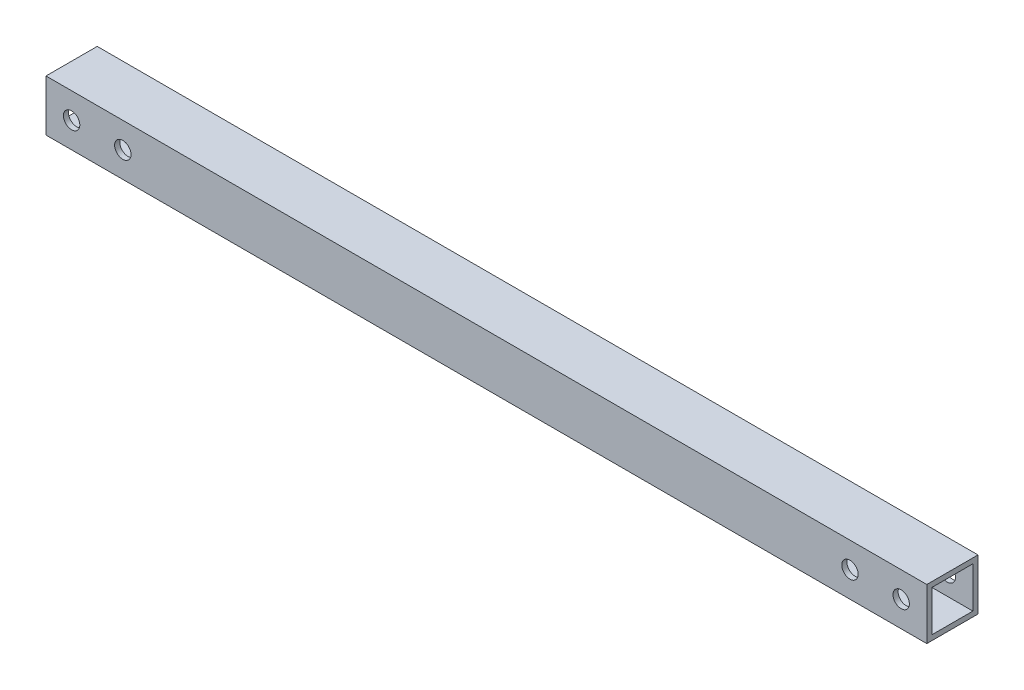
ISO-10303-21;
HEADER;
FILE_DESCRIPTION(('STEP AP214'),'2;1');
FILE_NAME('part.step','',(''),(''),'','','');
FILE_SCHEMA(('AUTOMOTIVE_DESIGN { 1 0 10303 214 1 1 1 1 }'));
ENDSEC;
DATA;
#1=APPLICATION_CONTEXT('core data for automotive mechanical design processes');
#2=APPLICATION_PROTOCOL_DEFINITION('international standard','automotive_design',2000,#1);
#3=PRODUCT_CONTEXT('',#1,'mechanical');
#4=PRODUCT('Part','Part','',(#3));
#5=PRODUCT_RELATED_PRODUCT_CATEGORY('part','',(#4));
#6=PRODUCT_DEFINITION_FORMATION('','',#4);
#7=PRODUCT_DEFINITION_CONTEXT('part definition',#1,'design');
#8=PRODUCT_DEFINITION('design','',#6,#7);
#9=PRODUCT_DEFINITION_SHAPE('','',#8);
#10=(LENGTH_UNIT() NAMED_UNIT(*) SI_UNIT(.MILLI.,.METRE.));
#11=(NAMED_UNIT(*) PLANE_ANGLE_UNIT() SI_UNIT($,.RADIAN.));
#12=(NAMED_UNIT(*) SI_UNIT($,.STERADIAN.) SOLID_ANGLE_UNIT());
#13=UNCERTAINTY_MEASURE_WITH_UNIT(LENGTH_MEASURE(1.E-05),#10,'distance_accuracy_value','');
#14=(GEOMETRIC_REPRESENTATION_CONTEXT(3) GLOBAL_UNCERTAINTY_ASSIGNED_CONTEXT((#13)) GLOBAL_UNIT_ASSIGNED_CONTEXT((#10,
#11,#12)) REPRESENTATION_CONTEXT('',''));
#15=CARTESIAN_POINT('',(0.,0.,0.));
#16=DIRECTION('',(0.,0.,1.));
#17=DIRECTION('',(1.,0.,0.));
#18=AXIS2_PLACEMENT_3D('',#15,#16,#17);
#19=CARTESIAN_POINT('',(172.,0.,0.));
#20=DIRECTION('',(1.,0.,0.));
#21=DIRECTION('',(0.,0.,-1.));
#22=AXIS2_PLACEMENT_3D('',#19,#20,#21);
#23=PLANE('',#22);
#24=DIRECTION('',(0.,1.,0.));
#25=VECTOR('',#24,1.);
#26=CARTESIAN_POINT('',(172.,5.,-5.));
#27=LINE('',#26,#25);
#28=CARTESIAN_POINT('',(172.,-5.,-5.));
#29=VERTEX_POINT('',#28);
#30=CARTESIAN_POINT('',(172.,5.,-5.));
#31=VERTEX_POINT('',#30);
#32=EDGE_CURVE('E164',#29,#31,#27,.T.);
#33=ORIENTED_EDGE('',*,*,#32,.T.);
#34=DIRECTION('',(0.,0.,1.));
#35=VECTOR('',#34,1.);
#36=CARTESIAN_POINT('',(172.,5.,5.));
#37=LINE('',#36,#35);
#38=CARTESIAN_POINT('',(172.,5.,5.));
#39=VERTEX_POINT('',#38);
#40=EDGE_CURVE('E167',#31,#39,#37,.T.);
#41=ORIENTED_EDGE('',*,*,#40,.T.);
#42=DIRECTION('',(0.,-1.,0.));
#43=VECTOR('',#42,1.);
#44=CARTESIAN_POINT('',(172.,5.,5.));
#45=LINE('',#44,#43);
#46=CARTESIAN_POINT('',(172.,-5.,5.));
#47=VERTEX_POINT('',#46);
#48=EDGE_CURVE('E170',#39,#47,#45,.T.);
#49=ORIENTED_EDGE('',*,*,#48,.T.);
#50=DIRECTION('',(0.,0.,-1.));
#51=VECTOR('',#50,1.);
#52=CARTESIAN_POINT('',(172.,-5.,5.));
#53=LINE('',#52,#51);
#54=EDGE_CURVE('E172',#47,#29,#53,.T.);
#55=ORIENTED_EDGE('',*,*,#54,.T.);
#56=EDGE_LOOP('',(#33,#41,#49,#55));
#57=FACE_BOUND('',#56,.T.);
#58=DIRECTION('',(0.,0.,1.));
#59=VECTOR('',#58,1.);
#60=CARTESIAN_POINT('',(172.,4.,5.));
#61=LINE('',#60,#59);
#62=CARTESIAN_POINT('',(172.,4.,-4.));
#63=VERTEX_POINT('',#62);
#64=CARTESIAN_POINT('',(172.,4.,4.));
#65=VERTEX_POINT('',#64);
#66=EDGE_CURVE('E134',#63,#65,#61,.T.);
#67=ORIENTED_EDGE('',*,*,#66,.F.);
#68=DIRECTION('',(0.,1.,0.));
#69=VECTOR('',#68,1.);
#70=CARTESIAN_POINT('',(172.,5.,-4.));
#71=LINE('',#70,#69);
#72=CARTESIAN_POINT('',(172.,-4.,-4.));
#73=VERTEX_POINT('',#72);
#74=EDGE_CURVE('E126',#73,#63,#71,.T.);
#75=ORIENTED_EDGE('',*,*,#74,.F.);
#76=DIRECTION('',(0.,0.,-1.));
#77=VECTOR('',#76,1.);
#78=CARTESIAN_POINT('',(172.,-4.,5.));
#79=LINE('',#78,#77);
#80=CARTESIAN_POINT('',(172.,-4.,4.));
#81=VERTEX_POINT('',#80);
#82=EDGE_CURVE('E148',#81,#73,#79,.T.);
#83=ORIENTED_EDGE('',*,*,#82,.F.);
#84=DIRECTION('',(0.,-1.,0.));
#85=VECTOR('',#84,1.);
#86=CARTESIAN_POINT('',(172.,5.,4.));
#87=LINE('',#86,#85);
#88=EDGE_CURVE('E146',#65,#81,#87,.T.);
#89=ORIENTED_EDGE('',*,*,#88,.F.);
#90=EDGE_LOOP('',(#67,#75,#83,#89));
#91=FACE_BOUND('',#90,.T.);
#92=ADVANCED_FACE('F59',(#57,#91),#23,.T.);
#93=CARTESIAN_POINT('',(0.,0.,0.));
#94=DIRECTION('',(1.,0.,0.));
#95=DIRECTION('',(0.,0.,-1.));
#96=AXIS2_PLACEMENT_3D('',#93,#94,#95);
#97=PLANE('',#96);
#98=DIRECTION('',(0.,1.,0.));
#99=VECTOR('',#98,1.);
#100=CARTESIAN_POINT('',(0.,5.,-5.));
#101=LINE('',#100,#99);
#102=CARTESIAN_POINT('',(0.,-5.,-5.));
#103=VERTEX_POINT('',#102);
#104=CARTESIAN_POINT('',(0.,5.,-5.));
#105=VERTEX_POINT('',#104);
#106=EDGE_CURVE('E142',#103,#105,#101,.T.);
#107=ORIENTED_EDGE('',*,*,#106,.F.);
#108=DIRECTION('',(0.,0.,-1.));
#109=VECTOR('',#108,1.);
#110=CARTESIAN_POINT('',(0.,-5.,5.));
#111=LINE('',#110,#109);
#112=CARTESIAN_POINT('',(0.,-5.,5.));
#113=VERTEX_POINT('',#112);
#114=EDGE_CURVE('E168',#113,#103,#111,.T.);
#115=ORIENTED_EDGE('',*,*,#114,.F.);
#116=DIRECTION('',(0.,-1.,0.));
#117=VECTOR('',#116,1.);
#118=CARTESIAN_POINT('',(0.,5.,5.));
#119=LINE('',#118,#117);
#120=CARTESIAN_POINT('',(0.,5.,5.));
#121=VERTEX_POINT('',#120);
#122=EDGE_CURVE('E179',#121,#113,#119,.T.);
#123=ORIENTED_EDGE('',*,*,#122,.F.);
#124=DIRECTION('',(0.,0.,1.));
#125=VECTOR('',#124,1.);
#126=CARTESIAN_POINT('',(0.,5.,5.));
#127=LINE('',#126,#125);
#128=EDGE_CURVE('E177',#105,#121,#127,.T.);
#129=ORIENTED_EDGE('',*,*,#128,.F.);
#130=EDGE_LOOP('',(#107,#115,#123,#129));
#131=FACE_BOUND('',#130,.T.);
#132=DIRECTION('',(0.,1.,0.));
#133=VECTOR('',#132,1.);
#134=CARTESIAN_POINT('',(0.,5.,-4.));
#135=LINE('',#134,#133);
#136=CARTESIAN_POINT('',(0.,-4.,-4.));
#137=VERTEX_POINT('',#136);
#138=CARTESIAN_POINT('',(0.,4.,-4.));
#139=VERTEX_POINT('',#138);
#140=EDGE_CURVE('E84',#137,#139,#135,.T.);
#141=ORIENTED_EDGE('',*,*,#140,.T.);
#142=DIRECTION('',(0.,0.,1.));
#143=VECTOR('',#142,1.);
#144=CARTESIAN_POINT('',(0.,4.,5.));
#145=LINE('',#144,#143);
#146=CARTESIAN_POINT('',(0.,4.,4.));
#147=VERTEX_POINT('',#146);
#148=EDGE_CURVE('E141',#139,#147,#145,.T.);
#149=ORIENTED_EDGE('',*,*,#148,.T.);
#150=DIRECTION('',(0.,-1.,0.));
#151=VECTOR('',#150,1.);
#152=CARTESIAN_POINT('',(0.,5.,4.));
#153=LINE('',#152,#151);
#154=CARTESIAN_POINT('',(0.,-4.,4.));
#155=VERTEX_POINT('',#154);
#156=EDGE_CURVE('E156',#147,#155,#153,.T.);
#157=ORIENTED_EDGE('',*,*,#156,.T.);
#158=DIRECTION('',(0.,0.,-1.));
#159=VECTOR('',#158,1.);
#160=CARTESIAN_POINT('',(0.,-4.,5.));
#161=LINE('',#160,#159);
#162=EDGE_CURVE('E135',#155,#137,#161,.T.);
#163=ORIENTED_EDGE('',*,*,#162,.T.);
#164=EDGE_LOOP('',(#141,#149,#157,#163));
#165=FACE_BOUND('',#164,.T.);
#166=ADVANCED_FACE('F231',(#131,#165),#97,.F.);
#167=CARTESIAN_POINT('',(172.,5.,-5.));
#168=DIRECTION('',(0.,0.,1.));
#169=DIRECTION('',(0.,-1.,0.));
#170=AXIS2_PLACEMENT_3D('',#167,#168,#169);
#171=PLANE('',#170);
#172=CARTESIAN_POINT('',(5.,0.,-5.));
#173=DIRECTION('',(0.,0.,1.));
#174=DIRECTION('',(1.,0.,0.));
#175=AXIS2_PLACEMENT_3D('',#172,#173,#174);
#176=CIRCLE('',#175,1.6);
#177=CARTESIAN_POINT('',(6.6,0.,-5.));
#178=VERTEX_POINT('',#177);
#179=EDGE_CURVE('E284',#178,#178,#176,.T.);
#180=ORIENTED_EDGE('',*,*,#179,.T.);
#181=EDGE_LOOP('',(#180));
#182=FACE_BOUND('',#181,.T.);
#183=CARTESIAN_POINT('',(167.,0.,-5.));
#184=DIRECTION('',(0.,0.,1.));
#185=DIRECTION('',(-1.,0.,0.));
#186=AXIS2_PLACEMENT_3D('',#183,#184,#185);
#187=CIRCLE('',#186,1.59999999999999);
#188=CARTESIAN_POINT('',(165.4,0.,-5.));
#189=VERTEX_POINT('',#188);
#190=EDGE_CURVE('E288',#189,#189,#187,.T.);
#191=ORIENTED_EDGE('',*,*,#190,.T.);
#192=EDGE_LOOP('',(#191));
#193=FACE_BOUND('',#192,.T.);
#194=CARTESIAN_POINT('',(157.,0.,-5.));
#195=DIRECTION('',(0.,0.,1.));
#196=DIRECTION('',(-1.,0.,0.));
#197=AXIS2_PLACEMENT_3D('',#194,#195,#196);
#198=CIRCLE('',#197,1.59999999999999);
#199=CARTESIAN_POINT('',(155.4,0.,-5.));
#200=VERTEX_POINT('',#199);
#201=EDGE_CURVE('E292',#200,#200,#198,.T.);
#202=ORIENTED_EDGE('',*,*,#201,.T.);
#203=EDGE_LOOP('',(#202));
#204=FACE_BOUND('',#203,.T.);
#205=CARTESIAN_POINT('',(15.,0.,-5.));
#206=DIRECTION('',(0.,0.,1.));
#207=DIRECTION('',(1.,0.,0.));
#208=AXIS2_PLACEMENT_3D('',#205,#206,#207);
#209=CIRCLE('',#208,1.6);
#210=CARTESIAN_POINT('',(16.6,0.,-5.));
#211=VERTEX_POINT('',#210);
#212=EDGE_CURVE('E193',#211,#211,#209,.T.);
#213=ORIENTED_EDGE('',*,*,#212,.T.);
#214=EDGE_LOOP('',(#213));
#215=FACE_BOUND('',#214,.T.);
#216=ORIENTED_EDGE('',*,*,#106,.T.);
#217=DIRECTION('',(-1.,0.,0.));
#218=VECTOR('',#217,1.);
#219=CARTESIAN_POINT('',(172.,5.,-5.));
#220=LINE('',#219,#218);
#221=EDGE_CURVE('E12',#31,#105,#220,.T.);
#222=ORIENTED_EDGE('',*,*,#221,.F.);
#223=ORIENTED_EDGE('',*,*,#32,.F.);
#224=DIRECTION('',(-1.,0.,0.));
#225=VECTOR('',#224,1.);
#226=CARTESIAN_POINT('',(172.,-5.,-5.));
#227=LINE('',#226,#225);
#228=EDGE_CURVE('E174',#29,#103,#227,.T.);
#229=ORIENTED_EDGE('',*,*,#228,.T.);
#230=EDGE_LOOP('',(#216,#222,#223,#229));
#231=FACE_BOUND('',#230,.T.);
#232=ADVANCED_FACE('F61',(#182,#193,#204,#215,#231),#171,.F.);
#233=CARTESIAN_POINT('',(172.,5.,5.));
#234=DIRECTION('',(0.,-1.,0.));
#235=DIRECTION('',(0.,0.,-1.));
#236=AXIS2_PLACEMENT_3D('',#233,#234,#235);
#237=PLANE('',#236);
#238=ORIENTED_EDGE('',*,*,#128,.T.);
#239=DIRECTION('',(-1.,0.,0.));
#240=VECTOR('',#239,1.);
#241=CARTESIAN_POINT('',(172.,5.,5.));
#242=LINE('',#241,#240);
#243=EDGE_CURVE('E68',#39,#121,#242,.T.);
#244=ORIENTED_EDGE('',*,*,#243,.F.);
#245=ORIENTED_EDGE('',*,*,#40,.F.);
#246=ORIENTED_EDGE('',*,*,#221,.T.);
#247=EDGE_LOOP('',(#238,#244,#245,#246));
#248=FACE_BOUND('',#247,.T.);
#249=ADVANCED_FACE('F259',(#248),#237,.F.);
#250=CARTESIAN_POINT('',(172.,5.,5.));
#251=DIRECTION('',(0.,0.,-1.));
#252=DIRECTION('',(0.,1.,0.));
#253=AXIS2_PLACEMENT_3D('',#250,#251,#252);
#254=PLANE('',#253);
#255=CARTESIAN_POINT('',(5.,0.,5.));
#256=DIRECTION('',(0.,0.,1.));
#257=DIRECTION('',(1.,0.,0.));
#258=AXIS2_PLACEMENT_3D('',#255,#256,#257);
#259=CIRCLE('',#258,1.6);
#260=CARTESIAN_POINT('',(6.6,0.,5.));
#261=VERTEX_POINT('',#260);
#262=EDGE_CURVE('E304',#261,#261,#259,.T.);
#263=ORIENTED_EDGE('',*,*,#262,.F.);
#264=EDGE_LOOP('',(#263));
#265=FACE_BOUND('',#264,.T.);
#266=CARTESIAN_POINT('',(167.,0.,5.));
#267=DIRECTION('',(0.,0.,1.));
#268=DIRECTION('',(-1.,0.,0.));
#269=AXIS2_PLACEMENT_3D('',#266,#267,#268);
#270=CIRCLE('',#269,1.59999999999999);
#271=CARTESIAN_POINT('',(165.4,0.,5.));
#272=VERTEX_POINT('',#271);
#273=EDGE_CURVE('E300',#272,#272,#270,.T.);
#274=ORIENTED_EDGE('',*,*,#273,.F.);
#275=EDGE_LOOP('',(#274));
#276=FACE_BOUND('',#275,.T.);
#277=CARTESIAN_POINT('',(157.,0.,5.));
#278=DIRECTION('',(0.,0.,1.));
#279=DIRECTION('',(-1.,0.,0.));
#280=AXIS2_PLACEMENT_3D('',#277,#278,#279);
#281=CIRCLE('',#280,1.59999999999999);
#282=CARTESIAN_POINT('',(155.4,0.,5.));
#283=VERTEX_POINT('',#282);
#284=EDGE_CURVE('E308',#283,#283,#281,.T.);
#285=ORIENTED_EDGE('',*,*,#284,.F.);
#286=EDGE_LOOP('',(#285));
#287=FACE_BOUND('',#286,.T.);
#288=CARTESIAN_POINT('',(15.,0.,5.));
#289=DIRECTION('',(0.,0.,1.));
#290=DIRECTION('',(1.,0.,0.));
#291=AXIS2_PLACEMENT_3D('',#288,#289,#290);
#292=CIRCLE('',#291,1.6);
#293=CARTESIAN_POINT('',(16.6,0.,5.));
#294=VERTEX_POINT('',#293);
#295=EDGE_CURVE('E296',#294,#294,#292,.T.);
#296=ORIENTED_EDGE('',*,*,#295,.F.);
#297=EDGE_LOOP('',(#296));
#298=FACE_BOUND('',#297,.T.);
#299=ORIENTED_EDGE('',*,*,#122,.T.);
#300=DIRECTION('',(-1.,0.,0.));
#301=VECTOR('',#300,1.);
#302=CARTESIAN_POINT('',(172.,-5.,5.));
#303=LINE('',#302,#301);
#304=EDGE_CURVE('E184',#47,#113,#303,.T.);
#305=ORIENTED_EDGE('',*,*,#304,.F.);
#306=ORIENTED_EDGE('',*,*,#48,.F.);
#307=ORIENTED_EDGE('',*,*,#243,.T.);
#308=EDGE_LOOP('',(#299,#305,#306,#307));
#309=FACE_BOUND('',#308,.T.);
#310=ADVANCED_FACE('F256',(#265,#276,#287,#298,#309),#254,.F.);
#311=CARTESIAN_POINT('',(172.,-5.,5.));
#312=DIRECTION('',(0.,1.,0.));
#313=DIRECTION('',(0.,0.,1.));
#314=AXIS2_PLACEMENT_3D('',#311,#312,#313);
#315=PLANE('',#314);
#316=ORIENTED_EDGE('',*,*,#114,.T.);
#317=ORIENTED_EDGE('',*,*,#228,.F.);
#318=ORIENTED_EDGE('',*,*,#54,.F.);
#319=ORIENTED_EDGE('',*,*,#304,.T.);
#320=EDGE_LOOP('',(#316,#317,#318,#319));
#321=FACE_BOUND('',#320,.T.);
#322=ADVANCED_FACE('F253',(#321),#315,.F.);
#323=CARTESIAN_POINT('',(172.,5.,-4.));
#324=DIRECTION('',(0.,0.,1.));
#325=DIRECTION('',(0.,-1.,0.));
#326=AXIS2_PLACEMENT_3D('',#323,#324,#325);
#327=PLANE('',#326);
#328=CARTESIAN_POINT('',(5.,0.,-4.));
#329=DIRECTION('',(0.,0.,1.));
#330=DIRECTION('',(0.,-1.,0.));
#331=AXIS2_PLACEMENT_3D('',#328,#329,#330);
#332=CIRCLE('',#331,1.6);
#333=CARTESIAN_POINT('',(5.,-1.6,-4.));
#334=VERTEX_POINT('',#333);
#335=EDGE_CURVE('E154',#334,#334,#332,.T.);
#336=ORIENTED_EDGE('',*,*,#335,.F.);
#337=EDGE_LOOP('',(#336));
#338=FACE_BOUND('',#337,.T.);
#339=CARTESIAN_POINT('',(167.,0.,-4.));
#340=DIRECTION('',(0.,0.,1.));
#341=DIRECTION('',(0.,-1.,0.));
#342=AXIS2_PLACEMENT_3D('',#339,#340,#341);
#343=CIRCLE('',#342,1.59999999999999);
#344=CARTESIAN_POINT('',(167.,-1.59999999999999,-4.));
#345=VERTEX_POINT('',#344);
#346=EDGE_CURVE('E199',#345,#345,#343,.T.);
#347=ORIENTED_EDGE('',*,*,#346,.F.);
#348=EDGE_LOOP('',(#347));
#349=FACE_BOUND('',#348,.T.);
#350=CARTESIAN_POINT('',(157.,0.,-4.));
#351=DIRECTION('',(0.,0.,1.));
#352=DIRECTION('',(0.,-1.,0.));
#353=AXIS2_PLACEMENT_3D('',#350,#351,#352);
#354=CIRCLE('',#353,1.59999999999999);
#355=CARTESIAN_POINT('',(157.,-1.59999999999999,-4.));
#356=VERTEX_POINT('',#355);
#357=EDGE_CURVE('E196',#356,#356,#354,.T.);
#358=ORIENTED_EDGE('',*,*,#357,.F.);
#359=EDGE_LOOP('',(#358));
#360=FACE_BOUND('',#359,.T.);
#361=CARTESIAN_POINT('',(15.,0.,-4.));
#362=DIRECTION('',(0.,0.,1.));
#363=DIRECTION('',(0.,-1.,0.));
#364=AXIS2_PLACEMENT_3D('',#361,#362,#363);
#365=CIRCLE('',#364,1.6);
#366=CARTESIAN_POINT('',(15.,-1.6,-4.));
#367=VERTEX_POINT('',#366);
#368=EDGE_CURVE('E192',#367,#367,#365,.T.);
#369=ORIENTED_EDGE('',*,*,#368,.F.);
#370=EDGE_LOOP('',(#369));
#371=FACE_BOUND('',#370,.T.);
#372=ORIENTED_EDGE('',*,*,#140,.F.);
#373=DIRECTION('',(-1.,0.,0.));
#374=VECTOR('',#373,1.);
#375=CARTESIAN_POINT('',(172.,-4.,-4.));
#376=LINE('',#375,#374);
#377=EDGE_CURVE('E130',#73,#137,#376,.T.);
#378=ORIENTED_EDGE('',*,*,#377,.F.);
#379=ORIENTED_EDGE('',*,*,#74,.T.);
#380=DIRECTION('',(-1.,0.,0.));
#381=VECTOR('',#380,1.);
#382=CARTESIAN_POINT('',(172.,4.,-4.));
#383=LINE('',#382,#381);
#384=EDGE_CURVE('E129',#63,#139,#383,.T.);
#385=ORIENTED_EDGE('',*,*,#384,.T.);
#386=EDGE_LOOP('',(#372,#378,#379,#385));
#387=FACE_BOUND('',#386,.T.);
#388=ADVANCED_FACE('F128',(#338,#349,#360,#371,#387),#327,.T.);
#389=CARTESIAN_POINT('',(172.,4.,5.));
#390=DIRECTION('',(0.,-1.,0.));
#391=DIRECTION('',(0.,0.,-1.));
#392=AXIS2_PLACEMENT_3D('',#389,#390,#391);
#393=PLANE('',#392);
#394=ORIENTED_EDGE('',*,*,#148,.F.);
#395=ORIENTED_EDGE('',*,*,#384,.F.);
#396=ORIENTED_EDGE('',*,*,#66,.T.);
#397=DIRECTION('',(-1.,0.,0.));
#398=VECTOR('',#397,1.);
#399=CARTESIAN_POINT('',(172.,4.,4.));
#400=LINE('',#399,#398);
#401=EDGE_CURVE('E143',#65,#147,#400,.T.);
#402=ORIENTED_EDGE('',*,*,#401,.T.);
#403=EDGE_LOOP('',(#394,#395,#396,#402));
#404=FACE_BOUND('',#403,.T.);
#405=ADVANCED_FACE('F138',(#404),#393,.T.);
#406=CARTESIAN_POINT('',(172.,5.,4.));
#407=DIRECTION('',(0.,0.,-1.));
#408=DIRECTION('',(0.,1.,0.));
#409=AXIS2_PLACEMENT_3D('',#406,#407,#408);
#410=PLANE('',#409);
#411=CARTESIAN_POINT('',(5.,0.,4.));
#412=DIRECTION('',(0.,0.,-1.));
#413=DIRECTION('',(0.,1.,0.));
#414=AXIS2_PLACEMENT_3D('',#411,#412,#413);
#415=CIRCLE('',#414,1.6);
#416=CARTESIAN_POINT('',(5.,1.6,4.));
#417=VERTEX_POINT('',#416);
#418=EDGE_CURVE('E63',#417,#417,#415,.T.);
#419=ORIENTED_EDGE('',*,*,#418,.F.);
#420=EDGE_LOOP('',(#419));
#421=FACE_BOUND('',#420,.T.);
#422=CARTESIAN_POINT('',(167.,0.,4.));
#423=DIRECTION('',(0.,0.,-1.));
#424=DIRECTION('',(0.,1.,0.));
#425=AXIS2_PLACEMENT_3D('',#422,#423,#424);
#426=CIRCLE('',#425,1.59999999999999);
#427=CARTESIAN_POINT('',(167.,1.59999999999999,4.));
#428=VERTEX_POINT('',#427);
#429=EDGE_CURVE('E197',#428,#428,#426,.T.);
#430=ORIENTED_EDGE('',*,*,#429,.F.);
#431=EDGE_LOOP('',(#430));
#432=FACE_BOUND('',#431,.T.);
#433=CARTESIAN_POINT('',(157.,0.,4.));
#434=DIRECTION('',(0.,0.,-1.));
#435=DIRECTION('',(0.,1.,0.));
#436=AXIS2_PLACEMENT_3D('',#433,#434,#435);
#437=CIRCLE('',#436,1.59999999999999);
#438=CARTESIAN_POINT('',(157.,1.59999999999999,4.));
#439=VERTEX_POINT('',#438);
#440=EDGE_CURVE('E194',#439,#439,#437,.T.);
#441=ORIENTED_EDGE('',*,*,#440,.F.);
#442=EDGE_LOOP('',(#441));
#443=FACE_BOUND('',#442,.T.);
#444=CARTESIAN_POINT('',(15.,0.,4.));
#445=DIRECTION('',(0.,0.,-1.));
#446=DIRECTION('',(0.,1.,0.));
#447=AXIS2_PLACEMENT_3D('',#444,#445,#446);
#448=CIRCLE('',#447,1.6);
#449=CARTESIAN_POINT('',(15.,1.6,4.));
#450=VERTEX_POINT('',#449);
#451=EDGE_CURVE('E189',#450,#450,#448,.T.);
#452=ORIENTED_EDGE('',*,*,#451,.F.);
#453=EDGE_LOOP('',(#452));
#454=FACE_BOUND('',#453,.T.);
#455=ORIENTED_EDGE('',*,*,#156,.F.);
#456=ORIENTED_EDGE('',*,*,#401,.F.);
#457=ORIENTED_EDGE('',*,*,#88,.T.);
#458=DIRECTION('',(-1.,0.,0.));
#459=VECTOR('',#458,1.);
#460=CARTESIAN_POINT('',(172.,-4.,4.));
#461=LINE('',#460,#459);
#462=EDGE_CURVE('E76',#81,#155,#461,.T.);
#463=ORIENTED_EDGE('',*,*,#462,.T.);
#464=EDGE_LOOP('',(#455,#456,#457,#463));
#465=FACE_BOUND('',#464,.T.);
#466=ADVANCED_FACE('F219',(#421,#432,#443,#454,#465),#410,.T.);
#467=CARTESIAN_POINT('',(172.,-4.,5.));
#468=DIRECTION('',(0.,1.,0.));
#469=DIRECTION('',(0.,0.,1.));
#470=AXIS2_PLACEMENT_3D('',#467,#468,#469);
#471=PLANE('',#470);
#472=ORIENTED_EDGE('',*,*,#162,.F.);
#473=ORIENTED_EDGE('',*,*,#462,.F.);
#474=ORIENTED_EDGE('',*,*,#82,.T.);
#475=ORIENTED_EDGE('',*,*,#377,.T.);
#476=EDGE_LOOP('',(#472,#473,#474,#475));
#477=FACE_BOUND('',#476,.T.);
#478=ADVANCED_FACE('F222',(#477),#471,.T.);
#479=CARTESIAN_POINT('',(15.,0.,-5.));
#480=DIRECTION('',(0.,0.,1.));
#481=DIRECTION('',(1.,0.,0.));
#482=AXIS2_PLACEMENT_3D('',#479,#480,#481);
#483=CYLINDRICAL_SURFACE('',#482,1.6);
#484=ORIENTED_EDGE('',*,*,#451,.T.);
#485=EDGE_LOOP('',(#484));
#486=FACE_BOUND('',#485,.T.);
#487=ORIENTED_EDGE('',*,*,#295,.T.);
#488=EDGE_LOOP('',(#487));
#489=FACE_BOUND('',#488,.T.);
#490=ADVANCED_FACE('F233',(#486,#489),#483,.F.);
#491=CARTESIAN_POINT('',(157.,0.,-5.));
#492=DIRECTION('',(0.,0.,1.));
#493=DIRECTION('',(1.,0.,0.));
#494=AXIS2_PLACEMENT_3D('',#491,#492,#493);
#495=CYLINDRICAL_SURFACE('',#494,1.59999999999999);
#496=ORIENTED_EDGE('',*,*,#440,.T.);
#497=EDGE_LOOP('',(#496));
#498=FACE_BOUND('',#497,.T.);
#499=ORIENTED_EDGE('',*,*,#284,.T.);
#500=EDGE_LOOP('',(#499));
#501=FACE_BOUND('',#500,.T.);
#502=ADVANCED_FACE('F238',(#498,#501),#495,.F.);
#503=CARTESIAN_POINT('',(167.,0.,-5.));
#504=DIRECTION('',(0.,0.,1.));
#505=DIRECTION('',(1.,0.,0.));
#506=AXIS2_PLACEMENT_3D('',#503,#504,#505);
#507=CYLINDRICAL_SURFACE('',#506,1.59999999999999);
#508=ORIENTED_EDGE('',*,*,#429,.T.);
#509=EDGE_LOOP('',(#508));
#510=FACE_BOUND('',#509,.T.);
#511=ORIENTED_EDGE('',*,*,#273,.T.);
#512=EDGE_LOOP('',(#511));
#513=FACE_BOUND('',#512,.T.);
#514=ADVANCED_FACE('F318',(#510,#513),#507,.F.);
#515=CARTESIAN_POINT('',(5.,0.,-5.));
#516=DIRECTION('',(0.,0.,1.));
#517=DIRECTION('',(1.,0.,0.));
#518=AXIS2_PLACEMENT_3D('',#515,#516,#517);
#519=CYLINDRICAL_SURFACE('',#518,1.6);
#520=ORIENTED_EDGE('',*,*,#418,.T.);
#521=EDGE_LOOP('',(#520));
#522=FACE_BOUND('',#521,.T.);
#523=ORIENTED_EDGE('',*,*,#262,.T.);
#524=EDGE_LOOP('',(#523));
#525=FACE_BOUND('',#524,.T.);
#526=ADVANCED_FACE('F216',(#522,#525),#519,.F.);
#527=ORIENTED_EDGE('',*,*,#368,.T.);
#528=EDGE_LOOP('',(#527));
#529=FACE_BOUND('',#528,.T.);
#530=ORIENTED_EDGE('',*,*,#212,.F.);
#531=EDGE_LOOP('',(#530));
#532=FACE_BOUND('',#531,.T.);
#533=ADVANCED_FACE('F241',(#529,#532),#483,.F.);
#534=ORIENTED_EDGE('',*,*,#357,.T.);
#535=EDGE_LOOP('',(#534));
#536=FACE_BOUND('',#535,.T.);
#537=ORIENTED_EDGE('',*,*,#201,.F.);
#538=EDGE_LOOP('',(#537));
#539=FACE_BOUND('',#538,.T.);
#540=ADVANCED_FACE('F321',(#536,#539),#495,.F.);
#541=ORIENTED_EDGE('',*,*,#346,.T.);
#542=EDGE_LOOP('',(#541));
#543=FACE_BOUND('',#542,.T.);
#544=ORIENTED_EDGE('',*,*,#190,.F.);
#545=EDGE_LOOP('',(#544));
#546=FACE_BOUND('',#545,.T.);
#547=ADVANCED_FACE('F326',(#543,#546),#507,.F.);
#548=ORIENTED_EDGE('',*,*,#335,.T.);
#549=EDGE_LOOP('',(#548));
#550=FACE_BOUND('',#549,.T.);
#551=ORIENTED_EDGE('',*,*,#179,.F.);
#552=EDGE_LOOP('',(#551));
#553=FACE_BOUND('',#552,.T.);
#554=ADVANCED_FACE('F333',(#550,#553),#519,.F.);
#555=CLOSED_SHELL('',(#92,#166,#232,#249,#310,#322,#388,#405,#466,#478,#490,#502,#514,#526,#533,
#540,#547,#554));
#556=MANIFOLD_SOLID_BREP('B2',#555);
#557=ADVANCED_BREP_SHAPE_REPRESENTATION('',(#18,#556),#14);
#558=SHAPE_DEFINITION_REPRESENTATION(#9,#557);
ENDSEC;
END-ISO-10303-21;
